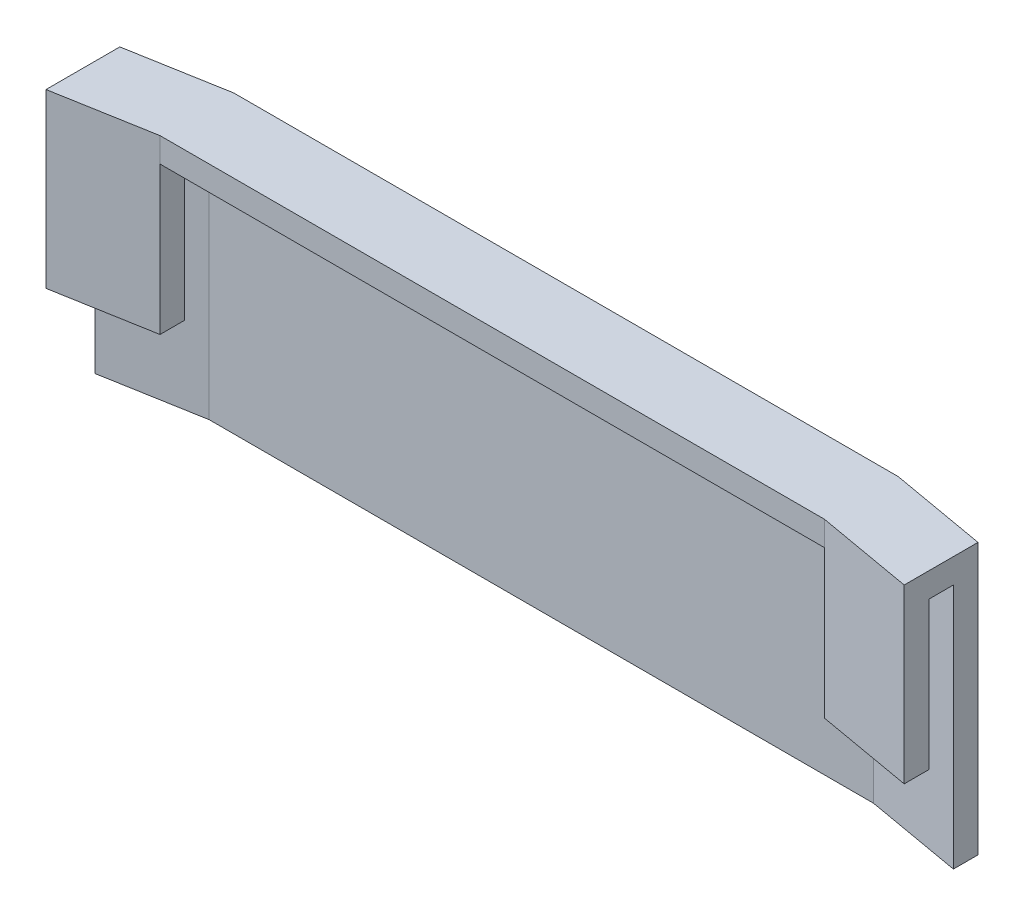
ISO-10303-21;
HEADER;
FILE_DESCRIPTION(('STEP AP214'),'2;1');
FILE_NAME('part.step','',(''),(''),'','','');
FILE_SCHEMA(('AUTOMOTIVE_DESIGN { 1 0 10303 214 1 1 1 1 }'));
ENDSEC;
DATA;
#1=APPLICATION_CONTEXT('core data for automotive mechanical design processes');
#2=APPLICATION_PROTOCOL_DEFINITION('international standard','automotive_design',2000,#1);
#3=PRODUCT_CONTEXT('',#1,'mechanical');
#4=PRODUCT('Part','Part','',(#3));
#5=PRODUCT_RELATED_PRODUCT_CATEGORY('part','',(#4));
#6=PRODUCT_DEFINITION_FORMATION('','',#4);
#7=PRODUCT_DEFINITION_CONTEXT('part definition',#1,'design');
#8=PRODUCT_DEFINITION('design','',#6,#7);
#9=PRODUCT_DEFINITION_SHAPE('','',#8);
#10=(LENGTH_UNIT() NAMED_UNIT(*) SI_UNIT(.MILLI.,.METRE.));
#11=(NAMED_UNIT(*) PLANE_ANGLE_UNIT() SI_UNIT($,.RADIAN.));
#12=(NAMED_UNIT(*) SI_UNIT($,.STERADIAN.) SOLID_ANGLE_UNIT());
#13=UNCERTAINTY_MEASURE_WITH_UNIT(LENGTH_MEASURE(1.E-05),#10,'distance_accuracy_value','');
#14=(GEOMETRIC_REPRESENTATION_CONTEXT(3) GLOBAL_UNCERTAINTY_ASSIGNED_CONTEXT((#13)) GLOBAL_UNIT_ASSIGNED_CONTEXT((#10,
#11,#12)) REPRESENTATION_CONTEXT('',''));
#15=CARTESIAN_POINT('',(0.,0.,0.));
#16=DIRECTION('',(0.,0.,1.));
#17=DIRECTION('',(1.,0.,0.));
#18=AXIS2_PLACEMENT_3D('',#15,#16,#17);
#19=CARTESIAN_POINT('',(0.,0.,0.));
#20=DIRECTION('',(0.,-1.,0.));
#21=DIRECTION('',(0.,0.,-1.));
#22=AXIS2_PLACEMENT_3D('',#19,#20,#21);
#23=PLANE('',#22);
#24=DIRECTION('',(0.984807753012208,0.,0.173648177666931));
#25=VECTOR('',#24,1.);
#26=CARTESIAN_POINT('',(34.8784620240973,0.,-0.610814578664608));
#27=LINE('',#26,#25);
#28=CARTESIAN_POINT('',(27.,0.,-2.));
#29=VERTEX_POINT('',#28);
#30=CARTESIAN_POINT('',(34.8784620240973,0.,-0.610814578664608));
#31=VERTEX_POINT('',#30);
#32=EDGE_CURVE('E189',#29,#31,#27,.T.);
#33=ORIENTED_EDGE('',*,*,#32,.F.);
#34=DIRECTION('',(0.,0.,-1.));
#35=VECTOR('',#34,1.);
#36=CARTESIAN_POINT('',(27.,0.,0.));
#37=LINE('',#36,#35);
#38=CARTESIAN_POINT('',(27.,0.,0.));
#39=VERTEX_POINT('',#38);
#40=EDGE_CURVE('E172',#39,#29,#37,.T.);
#41=ORIENTED_EDGE('',*,*,#40,.F.);
#42=DIRECTION('',(1.,0.,0.));
#43=VECTOR('',#42,1.);
#44=CARTESIAN_POINT('',(-27.,0.,0.));
#45=LINE('',#44,#43);
#46=CARTESIAN_POINT('',(-27.,0.,0.));
#47=VERTEX_POINT('',#46);
#48=EDGE_CURVE('E186',#47,#39,#45,.T.);
#49=ORIENTED_EDGE('',*,*,#48,.F.);
#50=DIRECTION('',(0.,0.,1.));
#51=VECTOR('',#50,1.);
#52=CARTESIAN_POINT('',(-27.,0.,0.));
#53=LINE('',#52,#51);
#54=CARTESIAN_POINT('',(-27.,0.,-2.));
#55=VERTEX_POINT('',#54);
#56=EDGE_CURVE('E351',#55,#47,#53,.T.);
#57=ORIENTED_EDGE('',*,*,#56,.F.);
#58=DIRECTION('',(0.984807753012209,0.,-0.173648177666923));
#59=VECTOR('',#58,1.);
#60=CARTESIAN_POINT('',(-27.,0.,-2.));
#61=LINE('',#60,#59);
#62=CARTESIAN_POINT('',(-34.8784620240977,0.,-0.61081457866461));
#63=VERTEX_POINT('',#62);
#64=EDGE_CURVE('E191',#63,#55,#61,.T.);
#65=ORIENTED_EDGE('',*,*,#64,.F.);
#66=DIRECTION('',(0.,0.,1.));
#67=VECTOR('',#66,1.);
#68=CARTESIAN_POINT('',(-34.8784620240977,0.,1.38918542133539));
#69=LINE('',#68,#67);
#70=CARTESIAN_POINT('',(-34.8784620240977,0.,-2.61081457866461));
#71=VERTEX_POINT('',#70);
#72=EDGE_CURVE('E252',#71,#63,#69,.T.);
#73=ORIENTED_EDGE('',*,*,#72,.F.);
#74=DIRECTION('',(-0.984807753012209,0.,0.173648177666923));
#75=VECTOR('',#74,1.);
#76=CARTESIAN_POINT('',(-1.49818990604147,0.,-8.49665717646815));
#77=LINE('',#76,#75);
#78=CARTESIAN_POINT('',(-27.,0.,-3.99999999999999));
#79=VERTEX_POINT('',#78);
#80=EDGE_CURVE('E11',#79,#71,#77,.T.);
#81=ORIENTED_EDGE('',*,*,#80,.F.);
#82=DIRECTION('',(-1.,0.,0.));
#83=VECTOR('',#82,1.);
#84=CARTESIAN_POINT('',(0.,0.,-3.99999999999999));
#85=LINE('',#84,#83);
#86=CARTESIAN_POINT('',(27.,0.,-3.99999999999999));
#87=VERTEX_POINT('',#86);
#88=EDGE_CURVE('E212',#87,#79,#85,.T.);
#89=ORIENTED_EDGE('',*,*,#88,.F.);
#90=DIRECTION('',(-0.984807753012208,0.,-0.17364817766693));
#91=VECTOR('',#90,1.);
#92=CARTESIAN_POINT('',(1.49818990604156,0.,-8.49665717646832));
#93=LINE('',#92,#91);
#94=CARTESIAN_POINT('',(34.8784620240973,0.,-2.61081457866461));
#95=VERTEX_POINT('',#94);
#96=EDGE_CURVE('E54',#95,#87,#93,.T.);
#97=ORIENTED_EDGE('',*,*,#96,.F.);
#98=DIRECTION('',(0.,0.,-1.));
#99=VECTOR('',#98,1.);
#100=CARTESIAN_POINT('',(34.8784620240973,0.,1.38918542133539));
#101=LINE('',#100,#99);
#102=EDGE_CURVE('E201',#31,#95,#101,.T.);
#103=ORIENTED_EDGE('',*,*,#102,.F.);
#104=EDGE_LOOP('',(#33,#41,#49,#57,#65,#73,#81,#89,#97,#103));
#105=FACE_BOUND('',#104,.T.);
#106=ADVANCED_FACE('F45',(#105),#23,.T.);
#107=CARTESIAN_POINT('',(-27.,2.,0.));
#108=DIRECTION('',(-0.173648177666924,0.,-0.984807753012209));
#109=DIRECTION('',(-0.984807753012209,0.,0.173648177666924));
#110=AXIS2_PLACEMENT_3D('',#107,#108,#109);
#111=PLANE('',#110);
#112=DIRECTION('',(0.,-1.,0.));
#113=VECTOR('',#112,1.);
#114=CARTESIAN_POINT('',(-34.8784620240977,2.,1.38918542133539));
#115=LINE('',#114,#113);
#116=CARTESIAN_POINT('',(-34.8784620240977,2.,1.38918542133539));
#117=VERTEX_POINT('',#116);
#118=CARTESIAN_POINT('',(-34.8784620240977,-12.,1.38918542133539));
#119=VERTEX_POINT('',#118);
#120=EDGE_CURVE('E271',#117,#119,#115,.T.);
#121=ORIENTED_EDGE('',*,*,#120,.T.);
#122=DIRECTION('',(-0.984807753012209,0.,0.173648177666924));
#123=VECTOR('',#122,1.);
#124=CARTESIAN_POINT('',(-34.8784620240977,-12.,1.38918542133539));
#125=LINE('',#124,#123);
#126=CARTESIAN_POINT('',(-27.,-12.,0.));
#127=VERTEX_POINT('',#126);
#128=EDGE_CURVE('E354',#127,#119,#125,.T.);
#129=ORIENTED_EDGE('',*,*,#128,.F.);
#130=DIRECTION('',(0.,1.,0.));
#131=VECTOR('',#130,1.);
#132=CARTESIAN_POINT('',(-27.,-12.,0.));
#133=LINE('',#132,#131);
#134=EDGE_CURVE('E346',#127,#47,#133,.T.);
#135=ORIENTED_EDGE('',*,*,#134,.T.);
#136=DIRECTION('',(0.,-1.,0.));
#137=VECTOR('',#136,1.);
#138=CARTESIAN_POINT('',(-27.,2.,0.));
#139=LINE('',#138,#137);
#140=CARTESIAN_POINT('',(-27.,2.,0.));
#141=VERTEX_POINT('',#140);
#142=EDGE_CURVE('E199',#141,#47,#139,.T.);
#143=ORIENTED_EDGE('',*,*,#142,.F.);
#144=DIRECTION('',(0.984807753012209,0.,-0.173648177666924));
#145=VECTOR('',#144,1.);
#146=CARTESIAN_POINT('',(-27.,2.,0.));
#147=LINE('',#146,#145);
#148=EDGE_CURVE('E247',#117,#141,#147,.T.);
#149=ORIENTED_EDGE('',*,*,#148,.F.);
#150=EDGE_LOOP('',(#121,#129,#135,#143,#149));
#151=FACE_BOUND('',#150,.T.);
#152=ADVANCED_FACE('F47',(#151),#111,.F.);
#153=CARTESIAN_POINT('',(-27.,2.,0.));
#154=DIRECTION('',(0.,0.,-1.));
#155=DIRECTION('',(-1.,0.,0.));
#156=AXIS2_PLACEMENT_3D('',#153,#154,#155);
#157=PLANE('',#156);
#158=ORIENTED_EDGE('',*,*,#48,.T.);
#159=DIRECTION('',(0.,-1.,0.));
#160=VECTOR('',#159,1.);
#161=CARTESIAN_POINT('',(27.,2.,0.));
#162=LINE('',#161,#160);
#163=CARTESIAN_POINT('',(27.,2.,0.));
#164=VERTEX_POINT('',#163);
#165=EDGE_CURVE('E196',#164,#39,#162,.T.);
#166=ORIENTED_EDGE('',*,*,#165,.F.);
#167=DIRECTION('',(1.,0.,0.));
#168=VECTOR('',#167,1.);
#169=CARTESIAN_POINT('',(-27.,2.,0.));
#170=LINE('',#169,#168);
#171=EDGE_CURVE('E251',#141,#164,#170,.T.);
#172=ORIENTED_EDGE('',*,*,#171,.F.);
#173=ORIENTED_EDGE('',*,*,#142,.T.);
#174=EDGE_LOOP('',(#158,#166,#172,#173));
#175=FACE_BOUND('',#174,.T.);
#176=ADVANCED_FACE('F195',(#175),#157,.F.);
#177=CARTESIAN_POINT('',(27.,2.,0.));
#178=DIRECTION('',(0.173648177666931,0.,-0.984807753012208));
#179=DIRECTION('',(-0.984807753012208,0.,-0.173648177666931));
#180=AXIS2_PLACEMENT_3D('',#177,#178,#179);
#181=PLANE('',#180);
#182=ORIENTED_EDGE('',*,*,#165,.T.);
#183=DIRECTION('',(0.,1.,0.));
#184=VECTOR('',#183,1.);
#185=CARTESIAN_POINT('',(27.,-12.,0.));
#186=LINE('',#185,#184);
#187=CARTESIAN_POINT('',(27.,-12.,0.));
#188=VERTEX_POINT('',#187);
#189=EDGE_CURVE('E168',#188,#39,#186,.T.);
#190=ORIENTED_EDGE('',*,*,#189,.F.);
#191=DIRECTION('',(-0.984807753012208,0.,-0.173648177666931));
#192=VECTOR('',#191,1.);
#193=CARTESIAN_POINT('',(27.,-12.,0.));
#194=LINE('',#193,#192);
#195=CARTESIAN_POINT('',(34.8784620240973,-12.,1.38918542133539));
#196=VERTEX_POINT('',#195);
#197=EDGE_CURVE('E180',#196,#188,#194,.T.);
#198=ORIENTED_EDGE('',*,*,#197,.F.);
#199=DIRECTION('',(0.,-1.,0.));
#200=VECTOR('',#199,1.);
#201=CARTESIAN_POINT('',(34.8784620240973,2.,1.38918542133539));
#202=LINE('',#201,#200);
#203=CARTESIAN_POINT('',(34.8784620240973,2.,1.38918542133539));
#204=VERTEX_POINT('',#203);
#205=EDGE_CURVE('E208',#204,#196,#202,.T.);
#206=ORIENTED_EDGE('',*,*,#205,.F.);
#207=DIRECTION('',(0.984807753012208,0.,0.173648177666931));
#208=VECTOR('',#207,1.);
#209=CARTESIAN_POINT('',(27.,2.,0.));
#210=LINE('',#209,#208);
#211=EDGE_CURVE('E206',#164,#204,#210,.T.);
#212=ORIENTED_EDGE('',*,*,#211,.F.);
#213=EDGE_LOOP('',(#182,#190,#198,#206,#212));
#214=FACE_BOUND('',#213,.T.);
#215=ADVANCED_FACE('F204',(#214),#181,.F.);
#216=CARTESIAN_POINT('',(34.8784620240973,2.,1.38918542133539));
#217=DIRECTION('',(-1.,0.,0.));
#218=DIRECTION('',(0.,0.,1.));
#219=AXIS2_PLACEMENT_3D('',#216,#217,#218);
#220=PLANE('',#219);
#221=ORIENTED_EDGE('',*,*,#205,.T.);
#222=DIRECTION('',(0.,0.,1.));
#223=VECTOR('',#222,1.);
#224=CARTESIAN_POINT('',(34.8784620240973,-12.,1.38918542133539));
#225=LINE('',#224,#223);
#226=CARTESIAN_POINT('',(34.8784620240973,-12.,-0.610814578664608));
#227=VERTEX_POINT('',#226);
#228=EDGE_CURVE('E373',#227,#196,#225,.T.);
#229=ORIENTED_EDGE('',*,*,#228,.F.);
#230=DIRECTION('',(0.,1.,0.));
#231=VECTOR('',#230,1.);
#232=CARTESIAN_POINT('',(34.8784620240973,-12.,-0.610814578664608));
#233=LINE('',#232,#231);
#234=EDGE_CURVE('E61',#227,#31,#233,.T.);
#235=ORIENTED_EDGE('',*,*,#234,.T.);
#236=ORIENTED_EDGE('',*,*,#102,.T.);
#237=DIRECTION('',(0.,1.,0.));
#238=VECTOR('',#237,1.);
#239=CARTESIAN_POINT('',(34.8784620240973,-20.,-2.61081457866461));
#240=LINE('',#239,#238);
#241=CARTESIAN_POINT('',(34.8784620240973,-20.,-2.61081457866461));
#242=VERTEX_POINT('',#241);
#243=EDGE_CURVE('E230',#242,#95,#240,.T.);
#244=ORIENTED_EDGE('',*,*,#243,.F.);
#245=DIRECTION('',(0.,0.,-1.));
#246=VECTOR('',#245,1.);
#247=CARTESIAN_POINT('',(34.8784620240973,-20.,-4.61081457866461));
#248=LINE('',#247,#246);
#249=CARTESIAN_POINT('',(34.8784620240973,-20.,-4.61081457866461));
#250=VERTEX_POINT('',#249);
#251=EDGE_CURVE('E304',#242,#250,#248,.T.);
#252=ORIENTED_EDGE('',*,*,#251,.T.);
#253=DIRECTION('',(0.,-1.,0.));
#254=VECTOR('',#253,1.);
#255=CARTESIAN_POINT('',(34.8784620240973,2.,-4.61081457866461));
#256=LINE('',#255,#254);
#257=CARTESIAN_POINT('',(34.8784620240973,2.,-4.61081457866461));
#258=VERTEX_POINT('',#257);
#259=EDGE_CURVE('E214',#258,#250,#256,.T.);
#260=ORIENTED_EDGE('',*,*,#259,.F.);
#261=DIRECTION('',(0.,0.,-1.));
#262=VECTOR('',#261,1.);
#263=CARTESIAN_POINT('',(34.8784620240973,2.,1.38918542133539));
#264=LINE('',#263,#262);
#265=EDGE_CURVE('E257',#204,#258,#264,.T.);
#266=ORIENTED_EDGE('',*,*,#265,.F.);
#267=EDGE_LOOP('',(#221,#229,#235,#236,#244,#252,#260,#266));
#268=FACE_BOUND('',#267,.T.);
#269=ADVANCED_FACE('F310',(#268),#220,.F.);
#270=CARTESIAN_POINT('',(27.,2.,-6.));
#271=DIRECTION('',(-0.173648177666931,0.,0.984807753012208));
#272=DIRECTION('',(0.984807753012208,0.,0.173648177666931));
#273=AXIS2_PLACEMENT_3D('',#270,#271,#272);
#274=PLANE('',#273);
#275=ORIENTED_EDGE('',*,*,#259,.T.);
#276=DIRECTION('',(-0.984807753012208,0.,-0.173648177666931));
#277=VECTOR('',#276,1.);
#278=CARTESIAN_POINT('',(34.8784620240973,-20.,-4.61081457866461));
#279=LINE('',#278,#277);
#280=CARTESIAN_POINT('',(27.,-20.,-6.));
#281=VERTEX_POINT('',#280);
#282=EDGE_CURVE('E296',#250,#281,#279,.T.);
#283=ORIENTED_EDGE('',*,*,#282,.T.);
#284=DIRECTION('',(0.,-1.,0.));
#285=VECTOR('',#284,1.);
#286=CARTESIAN_POINT('',(27.,2.,-6.));
#287=LINE('',#286,#285);
#288=CARTESIAN_POINT('',(27.,2.,-6.));
#289=VERTEX_POINT('',#288);
#290=EDGE_CURVE('E286',#289,#281,#287,.T.);
#291=ORIENTED_EDGE('',*,*,#290,.F.);
#292=DIRECTION('',(-0.984807753012208,0.,-0.173648177666931));
#293=VECTOR('',#292,1.);
#294=CARTESIAN_POINT('',(27.,2.,-6.));
#295=LINE('',#294,#293);
#296=EDGE_CURVE('E260',#258,#289,#295,.T.);
#297=ORIENTED_EDGE('',*,*,#296,.F.);
#298=EDGE_LOOP('',(#275,#283,#291,#297));
#299=FACE_BOUND('',#298,.T.);
#300=ADVANCED_FACE('F294',(#299),#274,.F.);
#301=CARTESIAN_POINT('',(-27.,2.,-6.));
#302=DIRECTION('',(0.,0.,1.));
#303=DIRECTION('',(1.,0.,0.));
#304=AXIS2_PLACEMENT_3D('',#301,#302,#303);
#305=PLANE('',#304);
#306=ORIENTED_EDGE('',*,*,#290,.T.);
#307=DIRECTION('',(-1.,0.,0.));
#308=VECTOR('',#307,1.);
#309=CARTESIAN_POINT('',(27.,-20.,-6.));
#310=LINE('',#309,#308);
#311=CARTESIAN_POINT('',(-27.,-20.,-6.));
#312=VERTEX_POINT('',#311);
#313=EDGE_CURVE('E307',#281,#312,#310,.T.);
#314=ORIENTED_EDGE('',*,*,#313,.T.);
#315=DIRECTION('',(0.,-1.,0.));
#316=VECTOR('',#315,1.);
#317=CARTESIAN_POINT('',(-27.,2.,-6.));
#318=LINE('',#317,#316);
#319=CARTESIAN_POINT('',(-27.,2.,-6.));
#320=VERTEX_POINT('',#319);
#321=EDGE_CURVE('E283',#320,#312,#318,.T.);
#322=ORIENTED_EDGE('',*,*,#321,.F.);
#323=DIRECTION('',(-1.,0.,0.));
#324=VECTOR('',#323,1.);
#325=CARTESIAN_POINT('',(-27.,2.,-6.));
#326=LINE('',#325,#324);
#327=EDGE_CURVE('E263',#289,#320,#326,.T.);
#328=ORIENTED_EDGE('',*,*,#327,.F.);
#329=EDGE_LOOP('',(#306,#314,#322,#328));
#330=FACE_BOUND('',#329,.T.);
#331=ADVANCED_FACE('F426',(#330),#305,.F.);
#332=CARTESIAN_POINT('',(-34.8784620240977,2.,-4.61081457866461));
#333=DIRECTION('',(0.173648177666924,0.,0.984807753012209));
#334=DIRECTION('',(0.984807753012209,0.,-0.173648177666924));
#335=AXIS2_PLACEMENT_3D('',#332,#333,#334);
#336=PLANE('',#335);
#337=ORIENTED_EDGE('',*,*,#321,.T.);
#338=DIRECTION('',(-0.984807753012209,0.,0.173648177666924));
#339=VECTOR('',#338,1.);
#340=CARTESIAN_POINT('',(-27.,-20.,-6.));
#341=LINE('',#340,#339);
#342=CARTESIAN_POINT('',(-34.8784620240977,-20.,-4.61081457866461));
#343=VERTEX_POINT('',#342);
#344=EDGE_CURVE('E320',#312,#343,#341,.T.);
#345=ORIENTED_EDGE('',*,*,#344,.T.);
#346=DIRECTION('',(0.,-1.,0.));
#347=VECTOR('',#346,1.);
#348=CARTESIAN_POINT('',(-34.8784620240977,2.,-4.61081457866461));
#349=LINE('',#348,#347);
#350=CARTESIAN_POINT('',(-34.8784620240977,2.,-4.61081457866461));
#351=VERTEX_POINT('',#350);
#352=EDGE_CURVE('E280',#351,#343,#349,.T.);
#353=ORIENTED_EDGE('',*,*,#352,.F.);
#354=DIRECTION('',(-0.984807753012209,0.,0.173648177666924));
#355=VECTOR('',#354,1.);
#356=CARTESIAN_POINT('',(-34.8784620240977,2.,-4.61081457866461));
#357=LINE('',#356,#355);
#358=EDGE_CURVE('E266',#320,#351,#357,.T.);
#359=ORIENTED_EDGE('',*,*,#358,.F.);
#360=EDGE_LOOP('',(#337,#345,#353,#359));
#361=FACE_BOUND('',#360,.T.);
#362=ADVANCED_FACE('F423',(#361),#336,.F.);
#363=CARTESIAN_POINT('',(-34.8784620240977,2.,1.38918542133539));
#364=DIRECTION('',(1.,0.,0.));
#365=DIRECTION('',(0.,0.,-1.));
#366=AXIS2_PLACEMENT_3D('',#363,#364,#365);
#367=PLANE('',#366);
#368=ORIENTED_EDGE('',*,*,#120,.F.);
#369=DIRECTION('',(0.,0.,1.));
#370=VECTOR('',#369,1.);
#371=CARTESIAN_POINT('',(-34.8784620240977,2.,1.38918542133539));
#372=LINE('',#371,#370);
#373=EDGE_CURVE('E269',#351,#117,#372,.T.);
#374=ORIENTED_EDGE('',*,*,#373,.F.);
#375=ORIENTED_EDGE('',*,*,#352,.T.);
#376=DIRECTION('',(0.,0.,1.));
#377=VECTOR('',#376,1.);
#378=CARTESIAN_POINT('',(-34.8784620240977,-20.,-4.61081457866461));
#379=LINE('',#378,#377);
#380=CARTESIAN_POINT('',(-34.8784620240977,-20.,-2.61081457866461));
#381=VERTEX_POINT('',#380);
#382=EDGE_CURVE('E243',#343,#381,#379,.T.);
#383=ORIENTED_EDGE('',*,*,#382,.T.);
#384=DIRECTION('',(0.,1.,0.));
#385=VECTOR('',#384,1.);
#386=CARTESIAN_POINT('',(-34.8784620240977,-20.,-2.61081457866461));
#387=LINE('',#386,#385);
#388=EDGE_CURVE('E202',#381,#71,#387,.T.);
#389=ORIENTED_EDGE('',*,*,#388,.T.);
#390=ORIENTED_EDGE('',*,*,#72,.T.);
#391=DIRECTION('',(0.,1.,0.));
#392=VECTOR('',#391,1.);
#393=CARTESIAN_POINT('',(-34.8784620240977,-12.,-0.61081457866461));
#394=LINE('',#393,#392);
#395=CARTESIAN_POINT('',(-34.8784620240977,-12.,-0.61081457866461));
#396=VERTEX_POINT('',#395);
#397=EDGE_CURVE('E338',#396,#63,#394,.T.);
#398=ORIENTED_EDGE('',*,*,#397,.F.);
#399=DIRECTION('',(0.,0.,-1.));
#400=VECTOR('',#399,1.);
#401=CARTESIAN_POINT('',(-34.8784620240977,-12.,1.38918542133539));
#402=LINE('',#401,#400);
#403=EDGE_CURVE('E362',#119,#396,#402,.T.);
#404=ORIENTED_EDGE('',*,*,#403,.F.);
#405=EDGE_LOOP('',(#368,#374,#375,#383,#389,#390,#398,#404));
#406=FACE_BOUND('',#405,.T.);
#407=ADVANCED_FACE('F330',(#406),#367,.F.);
#408=CARTESIAN_POINT('',(0.,2.,0.));
#409=DIRECTION('',(0.,-1.,0.));
#410=DIRECTION('',(0.,0.,-1.));
#411=AXIS2_PLACEMENT_3D('',#408,#409,#410);
#412=PLANE('',#411);
#413=ORIENTED_EDGE('',*,*,#373,.T.);
#414=ORIENTED_EDGE('',*,*,#148,.T.);
#415=ORIENTED_EDGE('',*,*,#171,.T.);
#416=ORIENTED_EDGE('',*,*,#211,.T.);
#417=ORIENTED_EDGE('',*,*,#265,.T.);
#418=ORIENTED_EDGE('',*,*,#296,.T.);
#419=ORIENTED_EDGE('',*,*,#327,.T.);
#420=ORIENTED_EDGE('',*,*,#358,.T.);
#421=EDGE_LOOP('',(#413,#414,#415,#416,#417,#418,#419,#420));
#422=FACE_BOUND('',#421,.T.);
#423=ADVANCED_FACE('F390',(#422),#412,.F.);
#424=CARTESIAN_POINT('',(-27.,-20.,-3.99999999999999));
#425=DIRECTION('',(0.173648177666923,0.,0.984807753012209));
#426=DIRECTION('',(0.984807753012209,0.,-0.173648177666923));
#427=AXIS2_PLACEMENT_3D('',#424,#425,#426);
#428=PLANE('',#427);
#429=DIRECTION('',(0.,1.,0.));
#430=VECTOR('',#429,1.);
#431=CARTESIAN_POINT('',(-27.,-20.,-3.99999999999999));
#432=LINE('',#431,#430);
#433=CARTESIAN_POINT('',(-27.,-20.,-3.99999999999999));
#434=VERTEX_POINT('',#433);
#435=EDGE_CURVE('E238',#434,#79,#432,.T.);
#436=ORIENTED_EDGE('',*,*,#435,.T.);
#437=ORIENTED_EDGE('',*,*,#80,.T.);
#438=ORIENTED_EDGE('',*,*,#388,.F.);
#439=DIRECTION('',(0.984807753012209,0.,-0.173648177666923));
#440=VECTOR('',#439,1.);
#441=CARTESIAN_POINT('',(-27.,-20.,-3.99999999999999));
#442=LINE('',#441,#440);
#443=EDGE_CURVE('E336',#381,#434,#442,.T.);
#444=ORIENTED_EDGE('',*,*,#443,.T.);
#445=EDGE_LOOP('',(#436,#437,#438,#444));
#446=FACE_BOUND('',#445,.T.);
#447=ADVANCED_FACE('F335',(#446),#428,.T.);
#448=CARTESIAN_POINT('',(27.,-20.,-3.99999999999999));
#449=DIRECTION('',(-0.17364817766693,0.,0.984807753012208));
#450=DIRECTION('',(0.984807753012208,0.,0.17364817766693));
#451=AXIS2_PLACEMENT_3D('',#448,#449,#450);
#452=PLANE('',#451);
#453=ORIENTED_EDGE('',*,*,#243,.T.);
#454=ORIENTED_EDGE('',*,*,#96,.T.);
#455=DIRECTION('',(0.,1.,0.));
#456=VECTOR('',#455,1.);
#457=CARTESIAN_POINT('',(27.,-20.,-3.99999999999999));
#458=LINE('',#457,#456);
#459=CARTESIAN_POINT('',(27.,-20.,-3.99999999999999));
#460=VERTEX_POINT('',#459);
#461=EDGE_CURVE('E228',#460,#87,#458,.T.);
#462=ORIENTED_EDGE('',*,*,#461,.F.);
#463=DIRECTION('',(0.984807753012208,0.,0.17364817766693));
#464=VECTOR('',#463,1.);
#465=CARTESIAN_POINT('',(27.,-20.,-3.99999999999999));
#466=LINE('',#465,#464);
#467=EDGE_CURVE('E312',#460,#242,#466,.T.);
#468=ORIENTED_EDGE('',*,*,#467,.T.);
#469=EDGE_LOOP('',(#453,#454,#462,#468));
#470=FACE_BOUND('',#469,.T.);
#471=ADVANCED_FACE('F226',(#470),#452,.T.);
#472=CARTESIAN_POINT('',(-27.,-20.,-3.99999999999999));
#473=DIRECTION('',(0.,0.,1.));
#474=DIRECTION('',(1.,0.,0.));
#475=AXIS2_PLACEMENT_3D('',#472,#473,#474);
#476=PLANE('',#475);
#477=ORIENTED_EDGE('',*,*,#461,.T.);
#478=ORIENTED_EDGE('',*,*,#88,.T.);
#479=ORIENTED_EDGE('',*,*,#435,.F.);
#480=DIRECTION('',(1.,0.,0.));
#481=VECTOR('',#480,1.);
#482=CARTESIAN_POINT('',(-27.,-20.,-3.99999999999999));
#483=LINE('',#482,#481);
#484=EDGE_CURVE('E236',#434,#460,#483,.T.);
#485=ORIENTED_EDGE('',*,*,#484,.T.);
#486=EDGE_LOOP('',(#477,#478,#479,#485));
#487=FACE_BOUND('',#486,.T.);
#488=ADVANCED_FACE('F233',(#487),#476,.T.);
#489=CARTESIAN_POINT('',(0.,-20.,0.));
#490=DIRECTION('',(0.,1.,0.));
#491=DIRECTION('',(0.,0.,1.));
#492=AXIS2_PLACEMENT_3D('',#489,#490,#491);
#493=PLANE('',#492);
#494=ORIENTED_EDGE('',*,*,#443,.F.);
#495=ORIENTED_EDGE('',*,*,#382,.F.);
#496=ORIENTED_EDGE('',*,*,#344,.F.);
#497=ORIENTED_EDGE('',*,*,#313,.F.);
#498=ORIENTED_EDGE('',*,*,#282,.F.);
#499=ORIENTED_EDGE('',*,*,#251,.F.);
#500=ORIENTED_EDGE('',*,*,#467,.F.);
#501=ORIENTED_EDGE('',*,*,#484,.F.);
#502=EDGE_LOOP('',(#494,#495,#496,#497,#498,#499,#500,#501));
#503=FACE_BOUND('',#502,.T.);
#504=ADVANCED_FACE('F303',(#503),#493,.F.);
#505=CARTESIAN_POINT('',(-27.,-12.,-2.));
#506=DIRECTION('',(0.173648177666923,0.,0.984807753012209));
#507=DIRECTION('',(0.984807753012209,0.,-0.173648177666923));
#508=AXIS2_PLACEMENT_3D('',#505,#506,#507);
#509=PLANE('',#508);
#510=ORIENTED_EDGE('',*,*,#64,.T.);
#511=DIRECTION('',(0.,1.,0.));
#512=VECTOR('',#511,1.);
#513=CARTESIAN_POINT('',(-27.,-12.,-2.));
#514=LINE('',#513,#512);
#515=CARTESIAN_POINT('',(-27.,-12.,-2.));
#516=VERTEX_POINT('',#515);
#517=EDGE_CURVE('E69',#516,#55,#514,.T.);
#518=ORIENTED_EDGE('',*,*,#517,.F.);
#519=DIRECTION('',(0.984807753012209,0.,-0.173648177666923));
#520=VECTOR('',#519,1.);
#521=CARTESIAN_POINT('',(-27.,-12.,-2.));
#522=LINE('',#521,#520);
#523=EDGE_CURVE('E359',#396,#516,#522,.T.);
#524=ORIENTED_EDGE('',*,*,#523,.F.);
#525=ORIENTED_EDGE('',*,*,#397,.T.);
#526=EDGE_LOOP('',(#510,#518,#524,#525));
#527=FACE_BOUND('',#526,.T.);
#528=ADVANCED_FACE('F399',(#527),#509,.F.);
#529=CARTESIAN_POINT('',(-27.,-12.,0.));
#530=DIRECTION('',(-1.,0.,0.));
#531=DIRECTION('',(0.,0.,1.));
#532=AXIS2_PLACEMENT_3D('',#529,#530,#531);
#533=PLANE('',#532);
#534=ORIENTED_EDGE('',*,*,#56,.T.);
#535=ORIENTED_EDGE('',*,*,#134,.F.);
#536=DIRECTION('',(0.,0.,1.));
#537=VECTOR('',#536,1.);
#538=CARTESIAN_POINT('',(-27.,-12.,0.));
#539=LINE('',#538,#537);
#540=EDGE_CURVE('E350',#516,#127,#539,.T.);
#541=ORIENTED_EDGE('',*,*,#540,.F.);
#542=ORIENTED_EDGE('',*,*,#517,.T.);
#543=EDGE_LOOP('',(#534,#535,#541,#542));
#544=FACE_BOUND('',#543,.T.);
#545=ADVANCED_FACE('F396',(#544),#533,.F.);
#546=CARTESIAN_POINT('',(0.,-12.,0.));
#547=DIRECTION('',(0.,1.,0.));
#548=DIRECTION('',(0.,0.,1.));
#549=AXIS2_PLACEMENT_3D('',#546,#547,#548);
#550=PLANE('',#549);
#551=ORIENTED_EDGE('',*,*,#128,.T.);
#552=ORIENTED_EDGE('',*,*,#403,.T.);
#553=ORIENTED_EDGE('',*,*,#523,.T.);
#554=ORIENTED_EDGE('',*,*,#540,.T.);
#555=EDGE_LOOP('',(#551,#552,#553,#554));
#556=FACE_BOUND('',#555,.T.);
#557=ADVANCED_FACE('F403',(#556),#550,.F.);
#558=CARTESIAN_POINT('',(27.,-12.,0.));
#559=DIRECTION('',(1.,0.,0.));
#560=DIRECTION('',(0.,0.,-1.));
#561=AXIS2_PLACEMENT_3D('',#558,#559,#560);
#562=PLANE('',#561);
#563=ORIENTED_EDGE('',*,*,#40,.T.);
#564=DIRECTION('',(0.,1.,0.));
#565=VECTOR('',#564,1.);
#566=CARTESIAN_POINT('',(27.,-12.,-2.));
#567=LINE('',#566,#565);
#568=CARTESIAN_POINT('',(27.,-12.,-2.));
#569=VERTEX_POINT('',#568);
#570=EDGE_CURVE('E383',#569,#29,#567,.T.);
#571=ORIENTED_EDGE('',*,*,#570,.F.);
#572=DIRECTION('',(0.,0.,-1.));
#573=VECTOR('',#572,1.);
#574=CARTESIAN_POINT('',(27.,-12.,0.));
#575=LINE('',#574,#573);
#576=EDGE_CURVE('E175',#188,#569,#575,.T.);
#577=ORIENTED_EDGE('',*,*,#576,.F.);
#578=ORIENTED_EDGE('',*,*,#189,.T.);
#579=EDGE_LOOP('',(#563,#571,#577,#578));
#580=FACE_BOUND('',#579,.T.);
#581=ADVANCED_FACE('F170',(#580),#562,.F.);
#582=CARTESIAN_POINT('',(34.8784620240973,-12.,-0.610814578664608));
#583=DIRECTION('',(-0.173648177666931,0.,0.984807753012208));
#584=DIRECTION('',(0.984807753012208,0.,0.173648177666931));
#585=AXIS2_PLACEMENT_3D('',#582,#583,#584);
#586=PLANE('',#585);
#587=ORIENTED_EDGE('',*,*,#32,.T.);
#588=ORIENTED_EDGE('',*,*,#234,.F.);
#589=DIRECTION('',(0.984807753012208,0.,0.173648177666931));
#590=VECTOR('',#589,1.);
#591=CARTESIAN_POINT('',(34.8784620240973,-12.,-0.610814578664608));
#592=LINE('',#591,#590);
#593=EDGE_CURVE('E370',#569,#227,#592,.T.);
#594=ORIENTED_EDGE('',*,*,#593,.F.);
#595=ORIENTED_EDGE('',*,*,#570,.T.);
#596=EDGE_LOOP('',(#587,#588,#594,#595));
#597=FACE_BOUND('',#596,.T.);
#598=ADVANCED_FACE('F386',(#597),#586,.F.);
#599=CARTESIAN_POINT('',(0.,-12.,0.));
#600=DIRECTION('',(0.,1.,0.));
#601=DIRECTION('',(0.,0.,1.));
#602=AXIS2_PLACEMENT_3D('',#599,#600,#601);
#603=PLANE('',#602);
#604=ORIENTED_EDGE('',*,*,#576,.T.);
#605=ORIENTED_EDGE('',*,*,#593,.T.);
#606=ORIENTED_EDGE('',*,*,#228,.T.);
#607=ORIENTED_EDGE('',*,*,#197,.T.);
#608=EDGE_LOOP('',(#604,#605,#606,#607));
#609=FACE_BOUND('',#608,.T.);
#610=ADVANCED_FACE('F388',(#609),#603,.F.);
#611=CLOSED_SHELL('',(#106,#152,#176,#215,#269,#300,#331,#362,#407,#423,#447,#471,#488,#504,
#528,#545,#557,#581,#598,#610));
#612=MANIFOLD_SOLID_BREP('B2',#611);
#613=ADVANCED_BREP_SHAPE_REPRESENTATION('',(#18,#612),#14);
#614=SHAPE_DEFINITION_REPRESENTATION(#9,#613);
ENDSEC;
END-ISO-10303-21;
